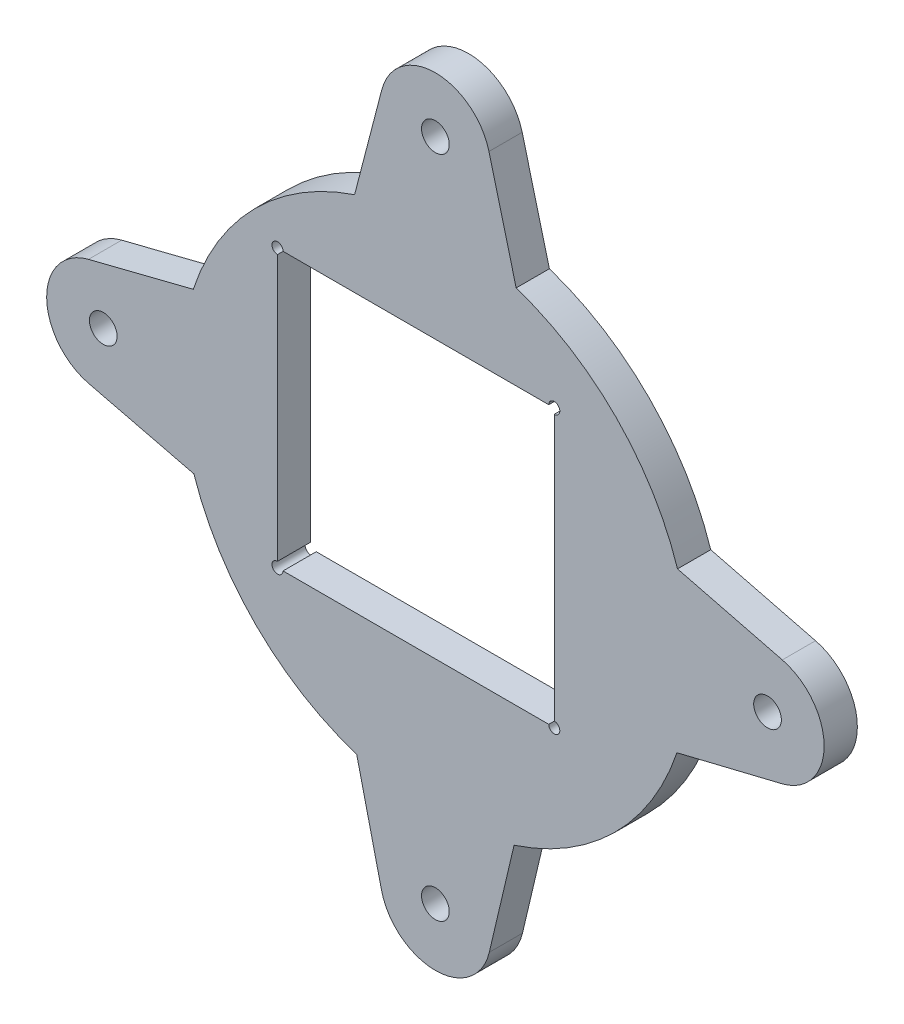
ISO-10303-21;
HEADER;
FILE_DESCRIPTION(('STEP AP214'),'2;1');
FILE_NAME('part.step','',(''),(''),'','','');
FILE_SCHEMA(('AUTOMOTIVE_DESIGN { 1 0 10303 214 1 1 1 1 }'));
ENDSEC;
DATA;
#1=APPLICATION_CONTEXT('core data for automotive mechanical design processes');
#2=APPLICATION_PROTOCOL_DEFINITION('international standard','automotive_design',2000,#1);
#3=PRODUCT_CONTEXT('',#1,'mechanical');
#4=PRODUCT('Part','Part','',(#3));
#5=PRODUCT_RELATED_PRODUCT_CATEGORY('part','',(#4));
#6=PRODUCT_DEFINITION_FORMATION('','',#4);
#7=PRODUCT_DEFINITION_CONTEXT('part definition',#1,'design');
#8=PRODUCT_DEFINITION('design','',#6,#7);
#9=PRODUCT_DEFINITION_SHAPE('','',#8);
#10=(LENGTH_UNIT() NAMED_UNIT(*) SI_UNIT(.MILLI.,.METRE.));
#11=(NAMED_UNIT(*) PLANE_ANGLE_UNIT() SI_UNIT($,.RADIAN.));
#12=(NAMED_UNIT(*) SI_UNIT($,.STERADIAN.) SOLID_ANGLE_UNIT());
#13=UNCERTAINTY_MEASURE_WITH_UNIT(LENGTH_MEASURE(1.E-05),#10,'distance_accuracy_value','');
#14=(GEOMETRIC_REPRESENTATION_CONTEXT(3) GLOBAL_UNCERTAINTY_ASSIGNED_CONTEXT((#13)) GLOBAL_UNIT_ASSIGNED_CONTEXT((#10,
#11,#12)) REPRESENTATION_CONTEXT('',''));
#15=CARTESIAN_POINT('',(0.,0.,0.));
#16=DIRECTION('',(0.,0.,1.));
#17=DIRECTION('',(1.,0.,0.));
#18=AXIS2_PLACEMENT_3D('',#15,#16,#17);
#19=CARTESIAN_POINT('',(-1.85100391915683,25.7433501337991,3.));
#20=DIRECTION('',(0.,0.,-1.));
#21=DIRECTION('',(-1.,0.,0.));
#22=AXIS2_PLACEMENT_3D('',#19,#20,#21);
#23=PLANE('',#22);
#24=CARTESIAN_POINT('',(-1.85100391915683,25.7433501337991,3.));
#25=DIRECTION('',(0.,0.,1.));
#26=DIRECTION('',(1.,0.,0.));
#27=AXIS2_PLACEMENT_3D('',#24,#25,#26);
#28=CIRCLE('',#27,1.25);
#29=CARTESIAN_POINT('',(-0.601003919156825,25.7433501337991,3.));
#30=VERTEX_POINT('',#29);
#31=EDGE_CURVE('E245',#30,#30,#28,.T.);
#32=ORIENTED_EDGE('',*,*,#31,.F.);
#33=EDGE_LOOP('',(#32));
#34=FACE_BOUND('',#33,.T.);
#35=CARTESIAN_POINT('',(-1.85100391915683,25.7433501337991,3.));
#36=DIRECTION('',(0.,0.,1.));
#37=DIRECTION('',(-1.,0.,0.));
#38=AXIS2_PLACEMENT_3D('',#35,#36,#37);
#39=CIRCLE('',#38,5.);
#40=CARTESIAN_POINT('',(2.98789015686646,27.0023593160638,3.));
#41=VERTEX_POINT('',#40);
#42=CARTESIAN_POINT('',(-6.68989799518011,27.0023593160638,3.));
#43=VERTEX_POINT('',#42);
#44=EDGE_CURVE('E251',#41,#43,#39,.T.);
#45=ORIENTED_EDGE('',*,*,#44,.T.);
#46=DIRECTION('',(-0.251801836452934,-0.967778815204657,0.));
#47=VECTOR('',#46,1.);
#48=CARTESIAN_POINT('',(-6.68989799518011,27.0023593160638,3.));
#49=LINE('',#48,#47);
#50=CARTESIAN_POINT('',(-9.14792080290552,17.5551589536027,3.));
#51=VERTEX_POINT('',#50);
#52=EDGE_CURVE('E254',#43,#51,#49,.T.);
#53=ORIENTED_EDGE('',*,*,#52,.T.);
#54=CARTESIAN_POINT('',(-1.85100391915683,-4.25664986620088,3.));
#55=DIRECTION('',(0.,0.,1.));
#56=DIRECTION('',(-1.,0.,0.));
#57=AXIS2_PLACEMENT_3D('',#54,#55,#56);
#58=CIRCLE('',#57,23.);
#59=CARTESIAN_POINT('',(-23.7211238591685,2.86359267247032,3.));
#60=VERTEX_POINT('',#59);
#61=EDGE_CURVE('E257',#51,#60,#58,.T.);
#62=ORIENTED_EDGE('',*,*,#61,.T.);
#63=DIRECTION('',(-0.96967564715584,-0.244395456817229,0.));
#64=VECTOR('',#63,1.);
#65=CARTESIAN_POINT('',(-33.186840592535,0.477868980286273,3.));
#66=LINE('',#65,#64);
#67=CARTESIAN_POINT('',(-33.186840592535,0.477868980286273,3.));
#68=VERTEX_POINT('',#67);
#69=EDGE_CURVE('E259',#60,#68,#66,.T.);
#70=ORIENTED_EDGE('',*,*,#69,.T.);
#71=CARTESIAN_POINT('',(-31.9648633084489,-4.37050925549292,3.));
#72=DIRECTION('',(0.,0.,1.));
#73=DIRECTION('',(-1.,0.,0.));
#74=AXIS2_PLACEMENT_3D('',#71,#72,#73);
#75=CIRCLE('',#74,4.99999999999999);
#76=CARTESIAN_POINT('',(-33.150143101344,-9.22798924130392,3.));
#77=VERTEX_POINT('',#76);
#78=EDGE_CURVE('E261',#68,#77,#75,.T.);
#79=ORIENTED_EDGE('',*,*,#78,.T.);
#80=DIRECTION('',(0.9714959971622,-0.237055958579029,0.));
#81=VECTOR('',#80,1.);
#82=CARTESIAN_POINT('',(-33.150143101344,-9.22798924130392,3.));
#83=LINE('',#82,#81);
#84=CARTESIAN_POINT('',(-23.6666565935521,-11.5420666964275,3.));
#85=VERTEX_POINT('',#84);
#86=EDGE_CURVE('E263',#77,#85,#83,.T.);
#87=ORIENTED_EDGE('',*,*,#86,.T.);
#88=CARTESIAN_POINT('',(-1.85100391915683,-4.25664986620088,3.));
#89=DIRECTION('',(0.,0.,1.));
#90=DIRECTION('',(-1.,0.,0.));
#91=AXIS2_PLACEMENT_3D('',#88,#89,#90);
#92=CIRCLE('',#91,23.);
#93=CARTESIAN_POINT('',(-8.95823485639791,-26.1310017058491,3.));
#94=VERTEX_POINT('',#93);
#95=EDGE_CURVE('E265',#85,#94,#92,.T.);
#96=ORIENTED_EDGE('',*,*,#95,.T.);
#97=DIRECTION('',(0.229543045164541,-0.973298510435822,0.));
#98=VECTOR('',#97,1.);
#99=CARTESIAN_POINT('',(-6.71749647133595,-35.6320838706077,3.));
#100=LINE('',#99,#98);
#101=CARTESIAN_POINT('',(-6.71749647133595,-35.6320838706077,3.));
#102=VERTEX_POINT('',#101);
#103=EDGE_CURVE('E267',#94,#102,#100,.T.);
#104=ORIENTED_EDGE('',*,*,#103,.T.);
#105=CARTESIAN_POINT('',(-1.85100391915684,-34.484368644785,3.));
#106=DIRECTION('',(0.,0.,1.));
#107=DIRECTION('',(-1.,0.,0.));
#108=AXIS2_PLACEMENT_3D('',#105,#106,#107);
#109=CIRCLE('',#108,5.);
#110=CARTESIAN_POINT('',(3.01548863302227,-35.6320838706077,3.));
#111=VERTEX_POINT('',#110);
#112=EDGE_CURVE('E269',#102,#111,#109,.T.);
#113=ORIENTED_EDGE('',*,*,#112,.T.);
#114=DIRECTION('',(0.229543045164542,0.973298510435821,0.));
#115=VECTOR('',#114,1.);
#116=CARTESIAN_POINT('',(3.01548863302227,-35.6320838706077,3.));
#117=LINE('',#116,#115);
#118=CARTESIAN_POINT('',(5.25622701808425,-26.1310017058491,3.));
#119=VERTEX_POINT('',#118);
#120=EDGE_CURVE('E271',#111,#119,#117,.T.);
#121=ORIENTED_EDGE('',*,*,#120,.T.);
#122=CARTESIAN_POINT('',(-1.85100391915683,-4.25664986620088,3.));
#123=DIRECTION('',(0.,0.,1.));
#124=DIRECTION('',(-1.,0.,0.));
#125=AXIS2_PLACEMENT_3D('',#122,#123,#124);
#126=CIRCLE('',#125,23.);
#127=CARTESIAN_POINT('',(19.9646487552385,-11.5420666964276,3.));
#128=VERTEX_POINT('',#127);
#129=EDGE_CURVE('E273',#119,#128,#126,.T.);
#130=ORIENTED_EDGE('',*,*,#129,.T.);
#131=DIRECTION('',(0.9714959971622,0.237055958579029,0.));
#132=VECTOR('',#131,1.);
#133=CARTESIAN_POINT('',(29.4481352630304,-9.22798924130392,3.));
#134=LINE('',#133,#132);
#135=CARTESIAN_POINT('',(29.4481352630304,-9.22798924130392,3.));
#136=VERTEX_POINT('',#135);
#137=EDGE_CURVE('E275',#128,#136,#134,.T.);
#138=ORIENTED_EDGE('',*,*,#137,.T.);
#139=CARTESIAN_POINT('',(28.2628554701352,-4.37050925549292,3.));
#140=DIRECTION('',(0.,0.,1.));
#141=DIRECTION('',(-1.,0.,0.));
#142=AXIS2_PLACEMENT_3D('',#139,#140,#141);
#143=CIRCLE('',#142,5.);
#144=CARTESIAN_POINT('',(29.4848327542214,0.477868980286283,3.));
#145=VERTEX_POINT('',#144);
#146=EDGE_CURVE('E277',#136,#145,#143,.T.);
#147=ORIENTED_EDGE('',*,*,#146,.T.);
#148=DIRECTION('',(-0.969675647155841,0.244395456817228,0.));
#149=VECTOR('',#148,1.);
#150=CARTESIAN_POINT('',(29.4848327542214,0.477868980286283,3.));
#151=LINE('',#150,#149);
#152=CARTESIAN_POINT('',(20.0191160208549,2.86359267247033,3.));
#153=VERTEX_POINT('',#152);
#154=EDGE_CURVE('E279',#145,#153,#151,.T.);
#155=ORIENTED_EDGE('',*,*,#154,.T.);
#156=CARTESIAN_POINT('',(-1.85100391915683,-4.25664986620088,3.));
#157=DIRECTION('',(0.,0.,1.));
#158=DIRECTION('',(-1.,0.,0.));
#159=AXIS2_PLACEMENT_3D('',#156,#157,#158);
#160=CIRCLE('',#159,23.);
#161=CARTESIAN_POINT('',(5.44591296459188,17.5551589536027,3.));
#162=VERTEX_POINT('',#161);
#163=EDGE_CURVE('E281',#153,#162,#160,.T.);
#164=ORIENTED_EDGE('',*,*,#163,.T.);
#165=DIRECTION('',(-0.251801836452935,0.967778815204657,0.));
#166=VECTOR('',#165,1.);
#167=CARTESIAN_POINT('',(2.98789015686646,27.0023593160638,3.));
#168=LINE('',#167,#166);
#169=EDGE_CURVE('E283',#162,#41,#168,.T.);
#170=ORIENTED_EDGE('',*,*,#169,.T.);
#171=EDGE_LOOP('',(#45,#53,#62,#70,#79,#87,#96,#104,#113,#121,#130,#138,#147,#155,#164,#170));
#172=FACE_BOUND('',#171,.T.);
#173=DIRECTION('',(1.,0.,0.));
#174=VECTOR('',#173,1.);
#175=CARTESIAN_POINT('',(-16.1130746243856,-15.1084385502642,3.));
#176=LINE('',#175,#174);
#177=CARTESIAN_POINT('',(-15.6130746243856,-15.1084385502642,3.));
#178=VERTEX_POINT('',#177);
#179=CARTESIAN_POINT('',(8.38692537561444,-15.1084385502642,3.));
#180=VERTEX_POINT('',#179);
#181=EDGE_CURVE('E235',#178,#180,#176,.T.);
#182=ORIENTED_EDGE('',*,*,#181,.F.);
#183=CARTESIAN_POINT('',(-16.1130746243856,-15.1084385502642,3.));
#184=DIRECTION('',(0.,0.,1.));
#185=DIRECTION('',(1.,0.,0.));
#186=AXIS2_PLACEMENT_3D('',#183,#184,#185);
#187=CIRCLE('',#186,0.499999999999999);
#188=CARTESIAN_POINT('',(-16.1130746243856,-14.6084385502642,3.));
#189=VERTEX_POINT('',#188);
#190=EDGE_CURVE('E205',#189,#178,#187,.T.);
#191=ORIENTED_EDGE('',*,*,#190,.F.);
#192=DIRECTION('',(0.,-1.,0.));
#193=VECTOR('',#192,1.);
#194=CARTESIAN_POINT('',(-16.1130746243856,-15.1084385502642,3.));
#195=LINE('',#194,#193);
#196=CARTESIAN_POINT('',(-16.1130746243856,9.39156144973582,3.));
#197=VERTEX_POINT('',#196);
#198=EDGE_CURVE('E224',#197,#189,#195,.T.);
#199=ORIENTED_EDGE('',*,*,#198,.F.);
#200=CARTESIAN_POINT('',(-16.1130746243856,9.89156144973582,3.));
#201=DIRECTION('',(0.,0.,1.));
#202=DIRECTION('',(1.,0.,0.));
#203=AXIS2_PLACEMENT_3D('',#200,#201,#202);
#204=CIRCLE('',#203,0.499999999999999);
#205=CARTESIAN_POINT('',(-15.6130746243856,9.89156144973582,3.));
#206=VERTEX_POINT('',#205);
#207=EDGE_CURVE('E57',#206,#197,#204,.T.);
#208=ORIENTED_EDGE('',*,*,#207,.F.);
#209=DIRECTION('',(-1.,0.,0.));
#210=VECTOR('',#209,1.);
#211=CARTESIAN_POINT('',(-16.1130746243856,9.89156144973582,3.));
#212=LINE('',#211,#210);
#213=CARTESIAN_POINT('',(8.38692537561444,9.89156144973582,3.));
#214=VERTEX_POINT('',#213);
#215=EDGE_CURVE('E220',#214,#206,#212,.T.);
#216=ORIENTED_EDGE('',*,*,#215,.F.);
#217=CARTESIAN_POINT('',(8.88692537561444,9.89156144973582,3.));
#218=DIRECTION('',(0.,0.,1.));
#219=DIRECTION('',(1.,0.,0.));
#220=AXIS2_PLACEMENT_3D('',#217,#218,#219);
#221=CIRCLE('',#220,0.500000000000001);
#222=CARTESIAN_POINT('',(8.88692537561444,9.39156144973582,3.));
#223=VERTEX_POINT('',#222);
#224=EDGE_CURVE('E49',#223,#214,#221,.T.);
#225=ORIENTED_EDGE('',*,*,#224,.F.);
#226=DIRECTION('',(0.,1.,0.));
#227=VECTOR('',#226,1.);
#228=CARTESIAN_POINT('',(8.88692537561444,-15.1084385502642,3.));
#229=LINE('',#228,#227);
#230=CARTESIAN_POINT('',(8.88692537561444,-14.6084385502642,3.));
#231=VERTEX_POINT('',#230);
#232=EDGE_CURVE('E212',#231,#223,#229,.T.);
#233=ORIENTED_EDGE('',*,*,#232,.F.);
#234=CARTESIAN_POINT('',(8.88692537561444,-15.1084385502642,3.));
#235=DIRECTION('',(0.,0.,1.));
#236=DIRECTION('',(1.,0.,0.));
#237=AXIS2_PLACEMENT_3D('',#234,#235,#236);
#238=CIRCLE('',#237,0.500000000000001);
#239=EDGE_CURVE('E194',#180,#231,#238,.T.);
#240=ORIENTED_EDGE('',*,*,#239,.F.);
#241=EDGE_LOOP('',(#182,#191,#199,#208,#216,#225,#233,#240));
#242=FACE_BOUND('',#241,.T.);
#243=CARTESIAN_POINT('',(28.1489960808432,-4.25664986620088,3.));
#244=DIRECTION('',(0.,0.,1.));
#245=DIRECTION('',(1.,0.,0.));
#246=AXIS2_PLACEMENT_3D('',#243,#244,#245);
#247=CIRCLE('',#246,1.25);
#248=CARTESIAN_POINT('',(29.3989960808432,-4.25664986620088,3.));
#249=VERTEX_POINT('',#248);
#250=EDGE_CURVE('E240',#249,#249,#247,.T.);
#251=ORIENTED_EDGE('',*,*,#250,.F.);
#252=EDGE_LOOP('',(#251));
#253=FACE_BOUND('',#252,.T.);
#254=CARTESIAN_POINT('',(-1.85100391915682,-34.2566498662009,3.));
#255=DIRECTION('',(0.,0.,1.));
#256=DIRECTION('',(1.,0.,0.));
#257=AXIS2_PLACEMENT_3D('',#254,#255,#256);
#258=CIRCLE('',#257,1.25);
#259=CARTESIAN_POINT('',(-0.60100391915682,-34.2566498662009,3.));
#260=VERTEX_POINT('',#259);
#261=EDGE_CURVE('E401',#260,#260,#258,.T.);
#262=ORIENTED_EDGE('',*,*,#261,.F.);
#263=EDGE_LOOP('',(#262));
#264=FACE_BOUND('',#263,.T.);
#265=CARTESIAN_POINT('',(-31.8510039191568,-4.25664986620089,3.));
#266=DIRECTION('',(0.,0.,1.));
#267=DIRECTION('',(1.,0.,0.));
#268=AXIS2_PLACEMENT_3D('',#265,#266,#267);
#269=CIRCLE('',#268,1.25);
#270=CARTESIAN_POINT('',(-30.6010039191568,-4.25664986620089,3.));
#271=VERTEX_POINT('',#270);
#272=EDGE_CURVE('E395',#271,#271,#269,.T.);
#273=ORIENTED_EDGE('',*,*,#272,.F.);
#274=EDGE_LOOP('',(#273));
#275=FACE_BOUND('',#274,.T.);
#276=ADVANCED_FACE('F35',(#34,#172,#242,#253,#264,#275),#23,.F.);
#277=CARTESIAN_POINT('',(-1.85100391915683,25.7433501337991,0.));
#278=DIRECTION('',(0.,0.,-1.));
#279=DIRECTION('',(-1.,0.,0.));
#280=AXIS2_PLACEMENT_3D('',#277,#278,#279);
#281=PLANE('',#280);
#282=CARTESIAN_POINT('',(-16.1130746243856,-15.1084385502642,0.));
#283=DIRECTION('',(0.,0.,-1.));
#284=DIRECTION('',(-1.,0.,0.));
#285=AXIS2_PLACEMENT_3D('',#282,#283,#284);
#286=CIRCLE('',#285,0.499999999999999);
#287=CARTESIAN_POINT('',(-15.6130746243856,-15.1084385502642,0.));
#288=VERTEX_POINT('',#287);
#289=CARTESIAN_POINT('',(-16.1130746243856,-14.6084385502642,0.));
#290=VERTEX_POINT('',#289);
#291=EDGE_CURVE('E215',#288,#290,#286,.T.);
#292=ORIENTED_EDGE('',*,*,#291,.F.);
#293=DIRECTION('',(1.,0.,0.));
#294=VECTOR('',#293,1.);
#295=CARTESIAN_POINT('',(-16.1130746243856,-15.1084385502642,0.));
#296=LINE('',#295,#294);
#297=CARTESIAN_POINT('',(8.38692537561444,-15.1084385502642,0.));
#298=VERTEX_POINT('',#297);
#299=EDGE_CURVE('E221',#288,#298,#296,.T.);
#300=ORIENTED_EDGE('',*,*,#299,.T.);
#301=CARTESIAN_POINT('',(8.88692537561444,-15.1084385502642,0.));
#302=DIRECTION('',(0.,0.,-1.));
#303=DIRECTION('',(-1.,0.,0.));
#304=AXIS2_PLACEMENT_3D('',#301,#302,#303);
#305=CIRCLE('',#304,0.500000000000001);
#306=CARTESIAN_POINT('',(8.88692537561444,-14.6084385502642,0.));
#307=VERTEX_POINT('',#306);
#308=EDGE_CURVE('E216',#307,#298,#305,.T.);
#309=ORIENTED_EDGE('',*,*,#308,.F.);
#310=DIRECTION('',(0.,1.,0.));
#311=VECTOR('',#310,1.);
#312=CARTESIAN_POINT('',(8.88692537561444,-15.1084385502642,0.));
#313=LINE('',#312,#311);
#314=CARTESIAN_POINT('',(8.88692537561444,9.39156144973582,0.));
#315=VERTEX_POINT('',#314);
#316=EDGE_CURVE('E214',#307,#315,#313,.T.);
#317=ORIENTED_EDGE('',*,*,#316,.T.);
#318=CARTESIAN_POINT('',(8.88692537561444,9.89156144973582,0.));
#319=DIRECTION('',(0.,0.,-1.));
#320=DIRECTION('',(-1.,0.,0.));
#321=AXIS2_PLACEMENT_3D('',#318,#319,#320);
#322=CIRCLE('',#321,0.500000000000001);
#323=CARTESIAN_POINT('',(8.38692537561444,9.89156144973582,0.));
#324=VERTEX_POINT('',#323);
#325=EDGE_CURVE('E390',#324,#315,#322,.T.);
#326=ORIENTED_EDGE('',*,*,#325,.F.);
#327=DIRECTION('',(-1.,0.,0.));
#328=VECTOR('',#327,1.);
#329=CARTESIAN_POINT('',(-16.1130746243856,9.89156144973582,0.));
#330=LINE('',#329,#328);
#331=CARTESIAN_POINT('',(-15.6130746243856,9.89156144973582,0.));
#332=VERTEX_POINT('',#331);
#333=EDGE_CURVE('E239',#324,#332,#330,.T.);
#334=ORIENTED_EDGE('',*,*,#333,.T.);
#335=CARTESIAN_POINT('',(-16.1130746243856,9.89156144973582,0.));
#336=DIRECTION('',(0.,0.,-1.));
#337=DIRECTION('',(-1.,0.,0.));
#338=AXIS2_PLACEMENT_3D('',#335,#336,#337);
#339=CIRCLE('',#338,0.499999999999999);
#340=CARTESIAN_POINT('',(-16.1130746243856,9.39156144973582,0.));
#341=VERTEX_POINT('',#340);
#342=EDGE_CURVE('E368',#341,#332,#339,.T.);
#343=ORIENTED_EDGE('',*,*,#342,.F.);
#344=DIRECTION('',(0.,-1.,0.));
#345=VECTOR('',#344,1.);
#346=CARTESIAN_POINT('',(-16.1130746243856,-15.1084385502642,0.));
#347=LINE('',#346,#345);
#348=EDGE_CURVE('E227',#341,#290,#347,.T.);
#349=ORIENTED_EDGE('',*,*,#348,.T.);
#350=EDGE_LOOP('',(#292,#300,#309,#317,#326,#334,#343,#349));
#351=FACE_BOUND('',#350,.T.);
#352=CARTESIAN_POINT('',(-1.85100391915682,-34.2566498662009,0.));
#353=DIRECTION('',(0.,0.,1.));
#354=DIRECTION('',(1.,0.,0.));
#355=AXIS2_PLACEMENT_3D('',#352,#353,#354);
#356=CIRCLE('',#355,1.25);
#357=CARTESIAN_POINT('',(-0.60100391915682,-34.2566498662009,0.));
#358=VERTEX_POINT('',#357);
#359=EDGE_CURVE('E398',#358,#358,#356,.T.);
#360=ORIENTED_EDGE('',*,*,#359,.T.);
#361=EDGE_LOOP('',(#360));
#362=FACE_BOUND('',#361,.T.);
#363=CARTESIAN_POINT('',(-1.85100391915683,25.7433501337991,0.));
#364=DIRECTION('',(0.,0.,1.));
#365=DIRECTION('',(1.,0.,0.));
#366=AXIS2_PLACEMENT_3D('',#363,#364,#365);
#367=CIRCLE('',#366,1.25);
#368=CARTESIAN_POINT('',(-0.601003919156825,25.7433501337991,0.));
#369=VERTEX_POINT('',#368);
#370=EDGE_CURVE('E237',#369,#369,#367,.T.);
#371=ORIENTED_EDGE('',*,*,#370,.T.);
#372=EDGE_LOOP('',(#371));
#373=FACE_BOUND('',#372,.T.);
#374=CARTESIAN_POINT('',(-1.85100391915683,25.7433501337991,0.));
#375=DIRECTION('',(0.,0.,1.));
#376=DIRECTION('',(-1.,0.,0.));
#377=AXIS2_PLACEMENT_3D('',#374,#375,#376);
#378=CIRCLE('',#377,5.);
#379=CARTESIAN_POINT('',(2.98789015686646,27.0023593160638,0.));
#380=VERTEX_POINT('',#379);
#381=CARTESIAN_POINT('',(-6.68989799518011,27.0023593160638,0.));
#382=VERTEX_POINT('',#381);
#383=EDGE_CURVE('E248',#380,#382,#378,.T.);
#384=ORIENTED_EDGE('',*,*,#383,.F.);
#385=DIRECTION('',(-0.251801836452935,0.967778815204657,0.));
#386=VECTOR('',#385,1.);
#387=CARTESIAN_POINT('',(2.98789015686646,27.0023593160638,0.));
#388=LINE('',#387,#386);
#389=CARTESIAN_POINT('',(5.44591296459188,17.5551589536027,0.));
#390=VERTEX_POINT('',#389);
#391=EDGE_CURVE('E255',#390,#380,#388,.T.);
#392=ORIENTED_EDGE('',*,*,#391,.F.);
#393=CARTESIAN_POINT('',(-1.85100391915683,-4.25664986620088,0.));
#394=DIRECTION('',(0.,0.,1.));
#395=DIRECTION('',(-1.,0.,0.));
#396=AXIS2_PLACEMENT_3D('',#393,#394,#395);
#397=CIRCLE('',#396,23.);
#398=CARTESIAN_POINT('',(20.0191160208549,2.86359267247033,0.));
#399=VERTEX_POINT('',#398);
#400=EDGE_CURVE('E314',#399,#390,#397,.T.);
#401=ORIENTED_EDGE('',*,*,#400,.F.);
#402=DIRECTION('',(-0.969675647155841,0.244395456817228,0.));
#403=VECTOR('',#402,1.);
#404=CARTESIAN_POINT('',(29.4848327542214,0.477868980286283,0.));
#405=LINE('',#404,#403);
#406=CARTESIAN_POINT('',(29.4848327542214,0.477868980286283,0.));
#407=VERTEX_POINT('',#406);
#408=EDGE_CURVE('E312',#407,#399,#405,.T.);
#409=ORIENTED_EDGE('',*,*,#408,.F.);
#410=CARTESIAN_POINT('',(28.2628554701352,-4.37050925549292,0.));
#411=DIRECTION('',(0.,0.,1.));
#412=DIRECTION('',(-1.,0.,0.));
#413=AXIS2_PLACEMENT_3D('',#410,#411,#412);
#414=CIRCLE('',#413,5.);
#415=CARTESIAN_POINT('',(29.4481352630304,-9.22798924130392,0.));
#416=VERTEX_POINT('',#415);
#417=EDGE_CURVE('E310',#416,#407,#414,.T.);
#418=ORIENTED_EDGE('',*,*,#417,.F.);
#419=DIRECTION('',(0.9714959971622,0.237055958579029,0.));
#420=VECTOR('',#419,1.);
#421=CARTESIAN_POINT('',(29.4481352630304,-9.22798924130392,0.));
#422=LINE('',#421,#420);
#423=CARTESIAN_POINT('',(19.9646487552385,-11.5420666964276,0.));
#424=VERTEX_POINT('',#423);
#425=EDGE_CURVE('E308',#424,#416,#422,.T.);
#426=ORIENTED_EDGE('',*,*,#425,.F.);
#427=CARTESIAN_POINT('',(-1.85100391915683,-4.25664986620088,0.));
#428=DIRECTION('',(0.,0.,1.));
#429=DIRECTION('',(-1.,0.,0.));
#430=AXIS2_PLACEMENT_3D('',#427,#428,#429);
#431=CIRCLE('',#430,23.);
#432=CARTESIAN_POINT('',(5.25622701808425,-26.1310017058491,0.));
#433=VERTEX_POINT('',#432);
#434=EDGE_CURVE('E306',#433,#424,#431,.T.);
#435=ORIENTED_EDGE('',*,*,#434,.F.);
#436=DIRECTION('',(0.229543045164542,0.973298510435821,0.));
#437=VECTOR('',#436,1.);
#438=CARTESIAN_POINT('',(3.01548863302227,-35.6320838706077,0.));
#439=LINE('',#438,#437);
#440=CARTESIAN_POINT('',(3.01548863302227,-35.6320838706077,0.));
#441=VERTEX_POINT('',#440);
#442=EDGE_CURVE('E304',#441,#433,#439,.T.);
#443=ORIENTED_EDGE('',*,*,#442,.F.);
#444=CARTESIAN_POINT('',(-1.85100391915684,-34.484368644785,0.));
#445=DIRECTION('',(0.,0.,1.));
#446=DIRECTION('',(-1.,0.,0.));
#447=AXIS2_PLACEMENT_3D('',#444,#445,#446);
#448=CIRCLE('',#447,5.);
#449=CARTESIAN_POINT('',(-6.71749647133595,-35.6320838706077,0.));
#450=VERTEX_POINT('',#449);
#451=EDGE_CURVE('E302',#450,#441,#448,.T.);
#452=ORIENTED_EDGE('',*,*,#451,.F.);
#453=DIRECTION('',(0.229543045164541,-0.973298510435822,0.));
#454=VECTOR('',#453,1.);
#455=CARTESIAN_POINT('',(-6.71749647133595,-35.6320838706077,0.));
#456=LINE('',#455,#454);
#457=CARTESIAN_POINT('',(-8.95823485639791,-26.1310017058491,0.));
#458=VERTEX_POINT('',#457);
#459=EDGE_CURVE('E300',#458,#450,#456,.T.);
#460=ORIENTED_EDGE('',*,*,#459,.F.);
#461=CARTESIAN_POINT('',(-1.85100391915683,-4.25664986620088,0.));
#462=DIRECTION('',(0.,0.,1.));
#463=DIRECTION('',(-1.,0.,0.));
#464=AXIS2_PLACEMENT_3D('',#461,#462,#463);
#465=CIRCLE('',#464,23.);
#466=CARTESIAN_POINT('',(-23.6666565935521,-11.5420666964275,0.));
#467=VERTEX_POINT('',#466);
#468=EDGE_CURVE('E298',#467,#458,#465,.T.);
#469=ORIENTED_EDGE('',*,*,#468,.F.);
#470=DIRECTION('',(0.9714959971622,-0.237055958579029,0.));
#471=VECTOR('',#470,1.);
#472=CARTESIAN_POINT('',(-33.150143101344,-9.22798924130392,0.));
#473=LINE('',#472,#471);
#474=CARTESIAN_POINT('',(-33.150143101344,-9.22798924130392,0.));
#475=VERTEX_POINT('',#474);
#476=EDGE_CURVE('E296',#475,#467,#473,.T.);
#477=ORIENTED_EDGE('',*,*,#476,.F.);
#478=CARTESIAN_POINT('',(-31.9648633084489,-4.37050925549292,0.));
#479=DIRECTION('',(0.,0.,1.));
#480=DIRECTION('',(-1.,0.,0.));
#481=AXIS2_PLACEMENT_3D('',#478,#479,#480);
#482=CIRCLE('',#481,4.99999999999999);
#483=CARTESIAN_POINT('',(-33.186840592535,0.477868980286273,0.));
#484=VERTEX_POINT('',#483);
#485=EDGE_CURVE('E294',#484,#475,#482,.T.);
#486=ORIENTED_EDGE('',*,*,#485,.F.);
#487=DIRECTION('',(-0.96967564715584,-0.244395456817229,0.));
#488=VECTOR('',#487,1.);
#489=CARTESIAN_POINT('',(-33.186840592535,0.477868980286273,0.));
#490=LINE('',#489,#488);
#491=CARTESIAN_POINT('',(-23.7211238591685,2.86359267247032,0.));
#492=VERTEX_POINT('',#491);
#493=EDGE_CURVE('E292',#492,#484,#490,.T.);
#494=ORIENTED_EDGE('',*,*,#493,.F.);
#495=CARTESIAN_POINT('',(-1.85100391915683,-4.25664986620088,0.));
#496=DIRECTION('',(0.,0.,1.));
#497=DIRECTION('',(-1.,0.,0.));
#498=AXIS2_PLACEMENT_3D('',#495,#496,#497);
#499=CIRCLE('',#498,23.);
#500=CARTESIAN_POINT('',(-9.14792080290552,17.5551589536027,0.));
#501=VERTEX_POINT('',#500);
#502=EDGE_CURVE('E290',#501,#492,#499,.T.);
#503=ORIENTED_EDGE('',*,*,#502,.F.);
#504=DIRECTION('',(-0.251801836452934,-0.967778815204657,0.));
#505=VECTOR('',#504,1.);
#506=CARTESIAN_POINT('',(-6.68989799518011,27.0023593160638,0.));
#507=LINE('',#506,#505);
#508=EDGE_CURVE('E288',#382,#501,#507,.T.);
#509=ORIENTED_EDGE('',*,*,#508,.F.);
#510=EDGE_LOOP('',(#384,#392,#401,#409,#418,#426,#435,#443,#452,#460,#469,#477,#486,#494,#503,#509));
#511=FACE_BOUND('',#510,.T.);
#512=CARTESIAN_POINT('',(28.1489960808432,-4.25664986620088,0.));
#513=DIRECTION('',(0.,0.,1.));
#514=DIRECTION('',(1.,0.,0.));
#515=AXIS2_PLACEMENT_3D('',#512,#513,#514);
#516=CIRCLE('',#515,1.25);
#517=CARTESIAN_POINT('',(29.3989960808432,-4.25664986620088,0.));
#518=VERTEX_POINT('',#517);
#519=EDGE_CURVE('E230',#518,#518,#516,.T.);
#520=ORIENTED_EDGE('',*,*,#519,.T.);
#521=EDGE_LOOP('',(#520));
#522=FACE_BOUND('',#521,.T.);
#523=CARTESIAN_POINT('',(-31.8510039191568,-4.25664986620089,0.));
#524=DIRECTION('',(0.,0.,1.));
#525=DIRECTION('',(1.,0.,0.));
#526=AXIS2_PLACEMENT_3D('',#523,#524,#525);
#527=CIRCLE('',#526,1.25);
#528=CARTESIAN_POINT('',(-30.6010039191568,-4.25664986620089,0.));
#529=VERTEX_POINT('',#528);
#530=EDGE_CURVE('E394',#529,#529,#527,.T.);
#531=ORIENTED_EDGE('',*,*,#530,.T.);
#532=EDGE_LOOP('',(#531));
#533=FACE_BOUND('',#532,.T.);
#534=ADVANCED_FACE('F375',(#351,#362,#373,#511,#522,#533),#281,.T.);
#535=CARTESIAN_POINT('',(-1.85100391915683,25.7433501337991,3.));
#536=DIRECTION('',(0.,0.,-1.));
#537=DIRECTION('',(-1.,0.,0.));
#538=AXIS2_PLACEMENT_3D('',#535,#536,#537);
#539=CYLINDRICAL_SURFACE('',#538,5.);
#540=ORIENTED_EDGE('',*,*,#383,.T.);
#541=DIRECTION('',(0.,0.,-1.));
#542=VECTOR('',#541,1.);
#543=CARTESIAN_POINT('',(-6.68989799518011,27.0023593160638,3.));
#544=LINE('',#543,#542);
#545=EDGE_CURVE('E361',#43,#382,#544,.T.);
#546=ORIENTED_EDGE('',*,*,#545,.F.);
#547=ORIENTED_EDGE('',*,*,#44,.F.);
#548=DIRECTION('',(0.,0.,-1.));
#549=VECTOR('',#548,1.);
#550=CARTESIAN_POINT('',(2.98789015686646,27.0023593160638,3.));
#551=LINE('',#550,#549);
#552=EDGE_CURVE('E285',#41,#380,#551,.T.);
#553=ORIENTED_EDGE('',*,*,#552,.T.);
#554=EDGE_LOOP('',(#540,#546,#547,#553));
#555=FACE_BOUND('',#554,.T.);
#556=ADVANCED_FACE('F37',(#555),#539,.T.);
#557=CARTESIAN_POINT('',(-6.68989799518011,27.0023593160638,3.));
#558=DIRECTION('',(0.967778815204657,-0.251801836452934,0.));
#559=DIRECTION('',(0.251801836452934,0.967778815204657,0.));
#560=AXIS2_PLACEMENT_3D('',#557,#558,#559);
#561=PLANE('',#560);
#562=ORIENTED_EDGE('',*,*,#508,.T.);
#563=DIRECTION('',(0.,0.,-1.));
#564=VECTOR('',#563,1.);
#565=CARTESIAN_POINT('',(-9.14792080290552,17.5551589536027,3.));
#566=LINE('',#565,#564);
#567=EDGE_CURVE('E358',#51,#501,#566,.T.);
#568=ORIENTED_EDGE('',*,*,#567,.F.);
#569=ORIENTED_EDGE('',*,*,#52,.F.);
#570=ORIENTED_EDGE('',*,*,#545,.T.);
#571=EDGE_LOOP('',(#562,#568,#569,#570));
#572=FACE_BOUND('',#571,.T.);
#573=ADVANCED_FACE('F494',(#572),#561,.F.);
#574=CARTESIAN_POINT('',(-1.85100391915683,-4.25664986620088,3.));
#575=DIRECTION('',(0.,0.,-1.));
#576=DIRECTION('',(-1.,0.,0.));
#577=AXIS2_PLACEMENT_3D('',#574,#575,#576);
#578=CYLINDRICAL_SURFACE('',#577,23.);
#579=ORIENTED_EDGE('',*,*,#502,.T.);
#580=DIRECTION('',(0.,0.,-1.));
#581=VECTOR('',#580,1.);
#582=CARTESIAN_POINT('',(-23.7211238591685,2.86359267247032,3.));
#583=LINE('',#582,#581);
#584=EDGE_CURVE('E355',#60,#492,#583,.T.);
#585=ORIENTED_EDGE('',*,*,#584,.F.);
#586=ORIENTED_EDGE('',*,*,#61,.F.);
#587=ORIENTED_EDGE('',*,*,#567,.T.);
#588=EDGE_LOOP('',(#579,#585,#586,#587));
#589=FACE_BOUND('',#588,.T.);
#590=ADVANCED_FACE('F491',(#589),#578,.T.);
#591=CARTESIAN_POINT('',(-33.186840592535,0.477868980286273,3.));
#592=DIRECTION('',(0.244395456817229,-0.96967564715584,0.));
#593=DIRECTION('',(0.969675647155841,0.244395456817229,0.));
#594=AXIS2_PLACEMENT_3D('',#591,#592,#593);
#595=PLANE('',#594);
#596=ORIENTED_EDGE('',*,*,#493,.T.);
#597=DIRECTION('',(0.,0.,-1.));
#598=VECTOR('',#597,1.);
#599=CARTESIAN_POINT('',(-33.186840592535,0.477868980286273,3.));
#600=LINE('',#599,#598);
#601=EDGE_CURVE('E352',#68,#484,#600,.T.);
#602=ORIENTED_EDGE('',*,*,#601,.F.);
#603=ORIENTED_EDGE('',*,*,#69,.F.);
#604=ORIENTED_EDGE('',*,*,#584,.T.);
#605=EDGE_LOOP('',(#596,#602,#603,#604));
#606=FACE_BOUND('',#605,.T.);
#607=ADVANCED_FACE('F487',(#606),#595,.F.);
#608=CARTESIAN_POINT('',(-31.9648633084489,-4.37050925549292,3.));
#609=DIRECTION('',(0.,0.,-1.));
#610=DIRECTION('',(-1.,0.,0.));
#611=AXIS2_PLACEMENT_3D('',#608,#609,#610);
#612=CYLINDRICAL_SURFACE('',#611,4.99999999999999);
#613=ORIENTED_EDGE('',*,*,#485,.T.);
#614=DIRECTION('',(0.,0.,-1.));
#615=VECTOR('',#614,1.);
#616=CARTESIAN_POINT('',(-33.150143101344,-9.22798924130392,3.));
#617=LINE('',#616,#615);
#618=EDGE_CURVE('E349',#77,#475,#617,.T.);
#619=ORIENTED_EDGE('',*,*,#618,.F.);
#620=ORIENTED_EDGE('',*,*,#78,.F.);
#621=ORIENTED_EDGE('',*,*,#601,.T.);
#622=EDGE_LOOP('',(#613,#619,#620,#621));
#623=FACE_BOUND('',#622,.T.);
#624=ADVANCED_FACE('F483',(#623),#612,.T.);
#625=CARTESIAN_POINT('',(-33.150143101344,-9.22798924130392,3.));
#626=DIRECTION('',(0.237055958579029,0.9714959971622,0.));
#627=DIRECTION('',(-0.9714959971622,0.237055958579029,0.));
#628=AXIS2_PLACEMENT_3D('',#625,#626,#627);
#629=PLANE('',#628);
#630=ORIENTED_EDGE('',*,*,#476,.T.);
#631=DIRECTION('',(0.,0.,-1.));
#632=VECTOR('',#631,1.);
#633=CARTESIAN_POINT('',(-23.6666565935521,-11.5420666964275,3.));
#634=LINE('',#633,#632);
#635=EDGE_CURVE('E346',#85,#467,#634,.T.);
#636=ORIENTED_EDGE('',*,*,#635,.F.);
#637=ORIENTED_EDGE('',*,*,#86,.F.);
#638=ORIENTED_EDGE('',*,*,#618,.T.);
#639=EDGE_LOOP('',(#630,#636,#637,#638));
#640=FACE_BOUND('',#639,.T.);
#641=ADVANCED_FACE('F479',(#640),#629,.F.);
#642=CARTESIAN_POINT('',(-1.85100391915683,-4.25664986620088,3.));
#643=DIRECTION('',(0.,0.,-1.));
#644=DIRECTION('',(-1.,0.,0.));
#645=AXIS2_PLACEMENT_3D('',#642,#643,#644);
#646=CYLINDRICAL_SURFACE('',#645,23.);
#647=ORIENTED_EDGE('',*,*,#468,.T.);
#648=DIRECTION('',(0.,0.,-1.));
#649=VECTOR('',#648,1.);
#650=CARTESIAN_POINT('',(-8.95823485639791,-26.1310017058491,3.));
#651=LINE('',#650,#649);
#652=EDGE_CURVE('E343',#94,#458,#651,.T.);
#653=ORIENTED_EDGE('',*,*,#652,.F.);
#654=ORIENTED_EDGE('',*,*,#95,.F.);
#655=ORIENTED_EDGE('',*,*,#635,.T.);
#656=EDGE_LOOP('',(#647,#653,#654,#655));
#657=FACE_BOUND('',#656,.T.);
#658=ADVANCED_FACE('F475',(#657),#646,.T.);
#659=CARTESIAN_POINT('',(-6.71749647133595,-35.6320838706077,3.));
#660=DIRECTION('',(0.973298510435822,0.229543045164541,0.));
#661=DIRECTION('',(-0.229543045164541,0.973298510435822,0.));
#662=AXIS2_PLACEMENT_3D('',#659,#660,#661);
#663=PLANE('',#662);
#664=ORIENTED_EDGE('',*,*,#459,.T.);
#665=DIRECTION('',(0.,0.,-1.));
#666=VECTOR('',#665,1.);
#667=CARTESIAN_POINT('',(-6.71749647133595,-35.6320838706077,3.));
#668=LINE('',#667,#666);
#669=EDGE_CURVE('E340',#102,#450,#668,.T.);
#670=ORIENTED_EDGE('',*,*,#669,.F.);
#671=ORIENTED_EDGE('',*,*,#103,.F.);
#672=ORIENTED_EDGE('',*,*,#652,.T.);
#673=EDGE_LOOP('',(#664,#670,#671,#672));
#674=FACE_BOUND('',#673,.T.);
#675=ADVANCED_FACE('F471',(#674),#663,.F.);
#676=CARTESIAN_POINT('',(-1.85100391915684,-34.484368644785,3.));
#677=DIRECTION('',(0.,0.,-1.));
#678=DIRECTION('',(-1.,0.,0.));
#679=AXIS2_PLACEMENT_3D('',#676,#677,#678);
#680=CYLINDRICAL_SURFACE('',#679,5.);
#681=ORIENTED_EDGE('',*,*,#451,.T.);
#682=DIRECTION('',(0.,0.,-1.));
#683=VECTOR('',#682,1.);
#684=CARTESIAN_POINT('',(3.01548863302227,-35.6320838706077,3.));
#685=LINE('',#684,#683);
#686=EDGE_CURVE('E337',#111,#441,#685,.T.);
#687=ORIENTED_EDGE('',*,*,#686,.F.);
#688=ORIENTED_EDGE('',*,*,#112,.F.);
#689=ORIENTED_EDGE('',*,*,#669,.T.);
#690=EDGE_LOOP('',(#681,#687,#688,#689));
#691=FACE_BOUND('',#690,.T.);
#692=ADVANCED_FACE('F467',(#691),#680,.T.);
#693=CARTESIAN_POINT('',(3.01548863302227,-35.6320838706077,3.));
#694=DIRECTION('',(-0.973298510435821,0.229543045164542,0.));
#695=DIRECTION('',(-0.229543045164542,-0.973298510435822,0.));
#696=AXIS2_PLACEMENT_3D('',#693,#694,#695);
#697=PLANE('',#696);
#698=ORIENTED_EDGE('',*,*,#442,.T.);
#699=DIRECTION('',(0.,0.,-1.));
#700=VECTOR('',#699,1.);
#701=CARTESIAN_POINT('',(5.25622701808425,-26.1310017058491,3.));
#702=LINE('',#701,#700);
#703=EDGE_CURVE('E334',#119,#433,#702,.T.);
#704=ORIENTED_EDGE('',*,*,#703,.F.);
#705=ORIENTED_EDGE('',*,*,#120,.F.);
#706=ORIENTED_EDGE('',*,*,#686,.T.);
#707=EDGE_LOOP('',(#698,#704,#705,#706));
#708=FACE_BOUND('',#707,.T.);
#709=ADVANCED_FACE('F463',(#708),#697,.F.);
#710=CARTESIAN_POINT('',(-1.85100391915683,-4.25664986620088,3.));
#711=DIRECTION('',(0.,0.,-1.));
#712=DIRECTION('',(-1.,0.,0.));
#713=AXIS2_PLACEMENT_3D('',#710,#711,#712);
#714=CYLINDRICAL_SURFACE('',#713,23.);
#715=ORIENTED_EDGE('',*,*,#434,.T.);
#716=DIRECTION('',(0.,0.,-1.));
#717=VECTOR('',#716,1.);
#718=CARTESIAN_POINT('',(19.9646487552385,-11.5420666964276,3.));
#719=LINE('',#718,#717);
#720=EDGE_CURVE('E331',#128,#424,#719,.T.);
#721=ORIENTED_EDGE('',*,*,#720,.F.);
#722=ORIENTED_EDGE('',*,*,#129,.F.);
#723=ORIENTED_EDGE('',*,*,#703,.T.);
#724=EDGE_LOOP('',(#715,#721,#722,#723));
#725=FACE_BOUND('',#724,.T.);
#726=ADVANCED_FACE('F459',(#725),#714,.T.);
#727=CARTESIAN_POINT('',(29.4481352630304,-9.22798924130392,3.));
#728=DIRECTION('',(-0.237055958579029,0.9714959971622,0.));
#729=DIRECTION('',(-0.9714959971622,-0.237055958579029,0.));
#730=AXIS2_PLACEMENT_3D('',#727,#728,#729);
#731=PLANE('',#730);
#732=ORIENTED_EDGE('',*,*,#425,.T.);
#733=DIRECTION('',(0.,0.,-1.));
#734=VECTOR('',#733,1.);
#735=CARTESIAN_POINT('',(29.4481352630304,-9.22798924130392,3.));
#736=LINE('',#735,#734);
#737=EDGE_CURVE('E328',#136,#416,#736,.T.);
#738=ORIENTED_EDGE('',*,*,#737,.F.);
#739=ORIENTED_EDGE('',*,*,#137,.F.);
#740=ORIENTED_EDGE('',*,*,#720,.T.);
#741=EDGE_LOOP('',(#732,#738,#739,#740));
#742=FACE_BOUND('',#741,.T.);
#743=ADVANCED_FACE('F455',(#742),#731,.F.);
#744=CARTESIAN_POINT('',(28.2628554701352,-4.37050925549292,3.));
#745=DIRECTION('',(0.,0.,-1.));
#746=DIRECTION('',(-1.,0.,0.));
#747=AXIS2_PLACEMENT_3D('',#744,#745,#746);
#748=CYLINDRICAL_SURFACE('',#747,5.);
#749=ORIENTED_EDGE('',*,*,#417,.T.);
#750=DIRECTION('',(0.,0.,-1.));
#751=VECTOR('',#750,1.);
#752=CARTESIAN_POINT('',(29.4848327542214,0.477868980286283,3.));
#753=LINE('',#752,#751);
#754=EDGE_CURVE('E325',#145,#407,#753,.T.);
#755=ORIENTED_EDGE('',*,*,#754,.F.);
#756=ORIENTED_EDGE('',*,*,#146,.F.);
#757=ORIENTED_EDGE('',*,*,#737,.T.);
#758=EDGE_LOOP('',(#749,#755,#756,#757));
#759=FACE_BOUND('',#758,.T.);
#760=ADVANCED_FACE('F451',(#759),#748,.T.);
#761=CARTESIAN_POINT('',(29.4848327542214,0.477868980286283,3.));
#762=DIRECTION('',(-0.244395456817228,-0.969675647155841,0.));
#763=DIRECTION('',(0.969675647155841,-0.244395456817228,0.));
#764=AXIS2_PLACEMENT_3D('',#761,#762,#763);
#765=PLANE('',#764);
#766=ORIENTED_EDGE('',*,*,#408,.T.);
#767=DIRECTION('',(0.,0.,-1.));
#768=VECTOR('',#767,1.);
#769=CARTESIAN_POINT('',(20.0191160208549,2.86359267247033,3.));
#770=LINE('',#769,#768);
#771=EDGE_CURVE('E322',#153,#399,#770,.T.);
#772=ORIENTED_EDGE('',*,*,#771,.F.);
#773=ORIENTED_EDGE('',*,*,#154,.F.);
#774=ORIENTED_EDGE('',*,*,#754,.T.);
#775=EDGE_LOOP('',(#766,#772,#773,#774));
#776=FACE_BOUND('',#775,.T.);
#777=ADVANCED_FACE('F447',(#776),#765,.F.);
#778=CARTESIAN_POINT('',(-1.85100391915683,-4.25664986620088,3.));
#779=DIRECTION('',(0.,0.,-1.));
#780=DIRECTION('',(-1.,0.,0.));
#781=AXIS2_PLACEMENT_3D('',#778,#779,#780);
#782=CYLINDRICAL_SURFACE('',#781,23.);
#783=ORIENTED_EDGE('',*,*,#400,.T.);
#784=DIRECTION('',(0.,0.,-1.));
#785=VECTOR('',#784,1.);
#786=CARTESIAN_POINT('',(5.44591296459188,17.5551589536027,3.));
#787=LINE('',#786,#785);
#788=EDGE_CURVE('E319',#162,#390,#787,.T.);
#789=ORIENTED_EDGE('',*,*,#788,.F.);
#790=ORIENTED_EDGE('',*,*,#163,.F.);
#791=ORIENTED_EDGE('',*,*,#771,.T.);
#792=EDGE_LOOP('',(#783,#789,#790,#791));
#793=FACE_BOUND('',#792,.T.);
#794=ADVANCED_FACE('F443',(#793),#782,.T.);
#795=CARTESIAN_POINT('',(2.98789015686646,27.0023593160638,3.));
#796=DIRECTION('',(-0.967778815204657,-0.251801836452935,0.));
#797=DIRECTION('',(0.251801836452935,-0.967778815204657,0.));
#798=AXIS2_PLACEMENT_3D('',#795,#796,#797);
#799=PLANE('',#798);
#800=ORIENTED_EDGE('',*,*,#391,.T.);
#801=ORIENTED_EDGE('',*,*,#552,.F.);
#802=ORIENTED_EDGE('',*,*,#169,.F.);
#803=ORIENTED_EDGE('',*,*,#788,.T.);
#804=EDGE_LOOP('',(#800,#801,#802,#803));
#805=FACE_BOUND('',#804,.T.);
#806=ADVANCED_FACE('F440',(#805),#799,.F.);
#807=CARTESIAN_POINT('',(-1.85100391915683,25.7433501337991,3.));
#808=DIRECTION('',(0.,0.,-1.));
#809=DIRECTION('',(-1.,0.,0.));
#810=AXIS2_PLACEMENT_3D('',#807,#808,#809);
#811=CYLINDRICAL_SURFACE('',#810,1.25);
#812=ORIENTED_EDGE('',*,*,#31,.T.);
#813=EDGE_LOOP('',(#812));
#814=FACE_BOUND('',#813,.T.);
#815=ORIENTED_EDGE('',*,*,#370,.F.);
#816=EDGE_LOOP('',(#815));
#817=FACE_BOUND('',#816,.T.);
#818=ADVANCED_FACE('F437',(#814,#817),#811,.F.);
#819=CARTESIAN_POINT('',(8.88692537561444,-15.1084385502642,3.));
#820=DIRECTION('',(-1.,0.,0.));
#821=DIRECTION('',(0.,0.,1.));
#822=AXIS2_PLACEMENT_3D('',#819,#820,#821);
#823=PLANE('',#822);
#824=DIRECTION('',(0.,0.,1.));
#825=VECTOR('',#824,1.);
#826=CARTESIAN_POINT('',(8.88692537561444,-14.6084385502642,-7.));
#827=LINE('',#826,#825);
#828=EDGE_CURVE('E197',#231,#307,#827,.F.);
#829=ORIENTED_EDGE('',*,*,#828,.F.);
#830=ORIENTED_EDGE('',*,*,#232,.T.);
#831=DIRECTION('',(0.,0.,1.));
#832=VECTOR('',#831,1.);
#833=CARTESIAN_POINT('',(8.88692537561444,9.39156144973582,-7.));
#834=LINE('',#833,#832);
#835=EDGE_CURVE('E392',#315,#223,#834,.T.);
#836=ORIENTED_EDGE('',*,*,#835,.F.);
#837=ORIENTED_EDGE('',*,*,#316,.F.);
#838=EDGE_LOOP('',(#829,#830,#836,#837));
#839=FACE_BOUND('',#838,.T.);
#840=ADVANCED_FACE('F210',(#839),#823,.T.);
#841=CARTESIAN_POINT('',(-16.1130746243856,9.89156144973582,3.));
#842=DIRECTION('',(0.,-1.,0.));
#843=DIRECTION('',(0.,0.,-1.));
#844=AXIS2_PLACEMENT_3D('',#841,#842,#843);
#845=PLANE('',#844);
#846=DIRECTION('',(0.,0.,1.));
#847=VECTOR('',#846,1.);
#848=CARTESIAN_POINT('',(8.38692537561444,9.89156144973582,-7.));
#849=LINE('',#848,#847);
#850=EDGE_CURVE('E11',#214,#324,#849,.F.);
#851=ORIENTED_EDGE('',*,*,#850,.F.);
#852=ORIENTED_EDGE('',*,*,#215,.T.);
#853=DIRECTION('',(0.,0.,1.));
#854=VECTOR('',#853,1.);
#855=CARTESIAN_POINT('',(-15.6130746243856,9.89156144973582,-7.));
#856=LINE('',#855,#854);
#857=EDGE_CURVE('E379',#332,#206,#856,.T.);
#858=ORIENTED_EDGE('',*,*,#857,.F.);
#859=ORIENTED_EDGE('',*,*,#333,.F.);
#860=EDGE_LOOP('',(#851,#852,#858,#859));
#861=FACE_BOUND('',#860,.T.);
#862=ADVANCED_FACE('F567',(#861),#845,.T.);
#863=CARTESIAN_POINT('',(-16.1130746243856,-15.1084385502642,3.));
#864=DIRECTION('',(1.,0.,0.));
#865=DIRECTION('',(0.,0.,-1.));
#866=AXIS2_PLACEMENT_3D('',#863,#864,#865);
#867=PLANE('',#866);
#868=DIRECTION('',(0.,0.,1.));
#869=VECTOR('',#868,1.);
#870=CARTESIAN_POINT('',(-16.1130746243856,-14.6084385502642,-7.));
#871=LINE('',#870,#869);
#872=EDGE_CURVE('E380',#290,#189,#871,.T.);
#873=ORIENTED_EDGE('',*,*,#872,.F.);
#874=ORIENTED_EDGE('',*,*,#348,.F.);
#875=DIRECTION('',(0.,0.,1.));
#876=VECTOR('',#875,1.);
#877=CARTESIAN_POINT('',(-16.1130746243856,9.39156144973582,-7.));
#878=LINE('',#877,#876);
#879=EDGE_CURVE('E43',#197,#341,#878,.F.);
#880=ORIENTED_EDGE('',*,*,#879,.F.);
#881=ORIENTED_EDGE('',*,*,#198,.T.);
#882=EDGE_LOOP('',(#873,#874,#880,#881));
#883=FACE_BOUND('',#882,.T.);
#884=ADVANCED_FACE('F383',(#883),#867,.T.);
#885=CARTESIAN_POINT('',(-16.1130746243856,-15.1084385502642,3.));
#886=DIRECTION('',(0.,1.,0.));
#887=DIRECTION('',(0.,0.,1.));
#888=AXIS2_PLACEMENT_3D('',#885,#886,#887);
#889=PLANE('',#888);
#890=DIRECTION('',(0.,0.,1.));
#891=VECTOR('',#890,1.);
#892=CARTESIAN_POINT('',(-15.6130746243856,-15.1084385502642,-7.));
#893=LINE('',#892,#891);
#894=EDGE_CURVE('E365',#178,#288,#893,.F.);
#895=ORIENTED_EDGE('',*,*,#894,.F.);
#896=ORIENTED_EDGE('',*,*,#181,.T.);
#897=DIRECTION('',(0.,0.,1.));
#898=VECTOR('',#897,1.);
#899=CARTESIAN_POINT('',(8.38692537561444,-15.1084385502642,-7.));
#900=LINE('',#899,#898);
#901=EDGE_CURVE('E200',#298,#180,#900,.T.);
#902=ORIENTED_EDGE('',*,*,#901,.F.);
#903=ORIENTED_EDGE('',*,*,#299,.F.);
#904=EDGE_LOOP('',(#895,#896,#902,#903));
#905=FACE_BOUND('',#904,.T.);
#906=ADVANCED_FACE('F416',(#905),#889,.T.);
#907=CARTESIAN_POINT('',(28.1489960808432,-4.25664986620088,3.));
#908=DIRECTION('',(0.,0.,-1.));
#909=DIRECTION('',(-1.,0.,0.));
#910=AXIS2_PLACEMENT_3D('',#907,#908,#909);
#911=CYLINDRICAL_SURFACE('',#910,1.25);
#912=ORIENTED_EDGE('',*,*,#250,.T.);
#913=EDGE_LOOP('',(#912));
#914=FACE_BOUND('',#913,.T.);
#915=ORIENTED_EDGE('',*,*,#519,.F.);
#916=EDGE_LOOP('',(#915));
#917=FACE_BOUND('',#916,.T.);
#918=ADVANCED_FACE('F413',(#914,#917),#911,.F.);
#919=CARTESIAN_POINT('',(-1.85100391915682,-34.2566498662009,3.));
#920=DIRECTION('',(0.,0.,-1.));
#921=DIRECTION('',(-1.,0.,0.));
#922=AXIS2_PLACEMENT_3D('',#919,#920,#921);
#923=CYLINDRICAL_SURFACE('',#922,1.25);
#924=ORIENTED_EDGE('',*,*,#261,.T.);
#925=EDGE_LOOP('',(#924));
#926=FACE_BOUND('',#925,.T.);
#927=ORIENTED_EDGE('',*,*,#359,.F.);
#928=EDGE_LOOP('',(#927));
#929=FACE_BOUND('',#928,.T.);
#930=ADVANCED_FACE('F415',(#926,#929),#923,.F.);
#931=CARTESIAN_POINT('',(-31.8510039191568,-4.25664986620089,3.));
#932=DIRECTION('',(0.,0.,-1.));
#933=DIRECTION('',(-1.,0.,0.));
#934=AXIS2_PLACEMENT_3D('',#931,#932,#933);
#935=CYLINDRICAL_SURFACE('',#934,1.25);
#936=ORIENTED_EDGE('',*,*,#272,.T.);
#937=EDGE_LOOP('',(#936));
#938=FACE_BOUND('',#937,.T.);
#939=ORIENTED_EDGE('',*,*,#530,.F.);
#940=EDGE_LOOP('',(#939));
#941=FACE_BOUND('',#940,.T.);
#942=ADVANCED_FACE('F422',(#938,#941),#935,.F.);
#943=CARTESIAN_POINT('',(8.88692537561444,-15.1084385502642,-7.));
#944=DIRECTION('',(0.,0.,1.));
#945=DIRECTION('',(1.,0.,0.));
#946=AXIS2_PLACEMENT_3D('',#943,#944,#945);
#947=CYLINDRICAL_SURFACE('',#946,0.500000000000001);
#948=ORIENTED_EDGE('',*,*,#828,.T.);
#949=ORIENTED_EDGE('',*,*,#308,.T.);
#950=ORIENTED_EDGE('',*,*,#901,.T.);
#951=ORIENTED_EDGE('',*,*,#239,.T.);
#952=EDGE_LOOP('',(#948,#949,#950,#951));
#953=FACE_BOUND('',#952,.T.);
#954=ADVANCED_FACE('F196',(#953),#947,.F.);
#955=CARTESIAN_POINT('',(-16.1130746243856,-15.1084385502642,-7.));
#956=DIRECTION('',(0.,0.,1.));
#957=DIRECTION('',(1.,0.,0.));
#958=AXIS2_PLACEMENT_3D('',#955,#956,#957);
#959=CYLINDRICAL_SURFACE('',#958,0.499999999999999);
#960=ORIENTED_EDGE('',*,*,#872,.T.);
#961=ORIENTED_EDGE('',*,*,#190,.T.);
#962=ORIENTED_EDGE('',*,*,#894,.T.);
#963=ORIENTED_EDGE('',*,*,#291,.T.);
#964=EDGE_LOOP('',(#960,#961,#962,#963));
#965=FACE_BOUND('',#964,.T.);
#966=ADVANCED_FACE('F601',(#965),#959,.F.);
#967=CARTESIAN_POINT('',(-16.1130746243856,9.89156144973582,-7.));
#968=DIRECTION('',(0.,0.,1.));
#969=DIRECTION('',(1.,0.,0.));
#970=AXIS2_PLACEMENT_3D('',#967,#968,#969);
#971=CYLINDRICAL_SURFACE('',#970,0.499999999999999);
#972=ORIENTED_EDGE('',*,*,#857,.T.);
#973=ORIENTED_EDGE('',*,*,#207,.T.);
#974=ORIENTED_EDGE('',*,*,#879,.T.);
#975=ORIENTED_EDGE('',*,*,#342,.T.);
#976=EDGE_LOOP('',(#972,#973,#974,#975));
#977=FACE_BOUND('',#976,.T.);
#978=ADVANCED_FACE('F367',(#977),#971,.F.);
#979=CARTESIAN_POINT('',(8.88692537561444,9.89156144973582,-7.));
#980=DIRECTION('',(0.,0.,1.));
#981=DIRECTION('',(1.,0.,0.));
#982=AXIS2_PLACEMENT_3D('',#979,#980,#981);
#983=CYLINDRICAL_SURFACE('',#982,0.500000000000001);
#984=ORIENTED_EDGE('',*,*,#835,.T.);
#985=ORIENTED_EDGE('',*,*,#224,.T.);
#986=ORIENTED_EDGE('',*,*,#850,.T.);
#987=ORIENTED_EDGE('',*,*,#325,.T.);
#988=EDGE_LOOP('',(#984,#985,#986,#987));
#989=FACE_BOUND('',#988,.T.);
#990=ADVANCED_FACE('F620',(#989),#983,.F.);
#991=CLOSED_SHELL('',(#276,#534,#556,#573,#590,#607,#624,#641,#658,#675,#692,#709,#726,#743,
#760,#777,#794,#806,#818,#840,#862,#884,#906,#918,#930,#942,#954,#966,#978,#990));
#992=MANIFOLD_SOLID_BREP('B2',#991);
#993=ADVANCED_BREP_SHAPE_REPRESENTATION('',(#18,#992),#14);
#994=SHAPE_DEFINITION_REPRESENTATION(#9,#993);
ENDSEC;
END-ISO-10303-21;
